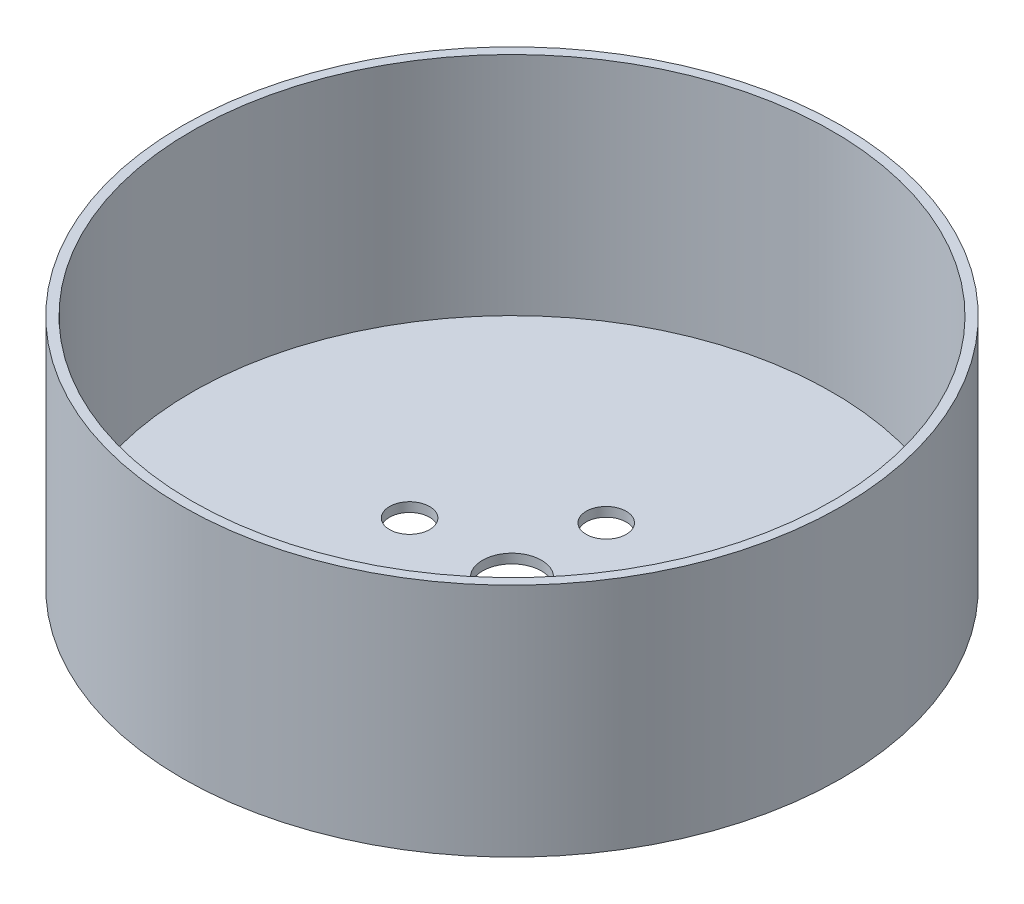
ISO-10303-21;
HEADER;
FILE_DESCRIPTION(('STEP AP214'),'2;1');
FILE_NAME('part.step','',(''),(''),'','','');
FILE_SCHEMA(('AUTOMOTIVE_DESIGN { 1 0 10303 214 1 1 1 1 }'));
ENDSEC;
DATA;
#1=APPLICATION_CONTEXT('core data for automotive mechanical design processes');
#2=APPLICATION_PROTOCOL_DEFINITION('international standard','automotive_design',2000,#1);
#3=PRODUCT_CONTEXT('',#1,'mechanical');
#4=PRODUCT('Part','Part','',(#3));
#5=PRODUCT_RELATED_PRODUCT_CATEGORY('part','',(#4));
#6=PRODUCT_DEFINITION_FORMATION('','',#4);
#7=PRODUCT_DEFINITION_CONTEXT('part definition',#1,'design');
#8=PRODUCT_DEFINITION('design','',#6,#7);
#9=PRODUCT_DEFINITION_SHAPE('','',#8);
#10=(LENGTH_UNIT() NAMED_UNIT(*) SI_UNIT(.MILLI.,.METRE.));
#11=(NAMED_UNIT(*) PLANE_ANGLE_UNIT() SI_UNIT($,.RADIAN.));
#12=(NAMED_UNIT(*) SI_UNIT($,.STERADIAN.) SOLID_ANGLE_UNIT());
#13=UNCERTAINTY_MEASURE_WITH_UNIT(LENGTH_MEASURE(1.E-05),#10,'distance_accuracy_value','');
#14=(GEOMETRIC_REPRESENTATION_CONTEXT(3) GLOBAL_UNCERTAINTY_ASSIGNED_CONTEXT((#13)) GLOBAL_UNIT_ASSIGNED_CONTEXT((#10,
#11,#12)) REPRESENTATION_CONTEXT('',''));
#15=CARTESIAN_POINT('',(0.,0.,0.));
#16=DIRECTION('',(0.,0.,1.));
#17=DIRECTION('',(1.,0.,0.));
#18=AXIS2_PLACEMENT_3D('',#15,#16,#17);
#19=CARTESIAN_POINT('',(0.,20.,0.));
#20=DIRECTION('',(0.,-1.,0.));
#21=DIRECTION('',(0.,0.,-1.));
#22=AXIS2_PLACEMENT_3D('',#19,#20,#21);
#23=CYLINDRICAL_SURFACE('',#22,28.);
#24=CARTESIAN_POINT('',(0.,20.,0.));
#25=DIRECTION('',(0.,1.,0.));
#26=DIRECTION('',(0.,0.,1.));
#27=AXIS2_PLACEMENT_3D('',#24,#25,#26);
#28=CIRCLE('',#27,28.);
#29=CARTESIAN_POINT('',(0.,20.,28.));
#30=VERTEX_POINT('',#29);
#31=EDGE_CURVE('E11',#30,#30,#28,.T.);
#32=ORIENTED_EDGE('',*,*,#31,.F.);
#33=EDGE_LOOP('',(#32));
#34=FACE_BOUND('',#33,.T.);
#35=CARTESIAN_POINT('',(0.,0.,0.));
#36=DIRECTION('',(0.,1.,0.));
#37=DIRECTION('',(0.,0.,1.));
#38=AXIS2_PLACEMENT_3D('',#35,#36,#37);
#39=CIRCLE('',#38,28.);
#40=CARTESIAN_POINT('',(0.,0.,28.));
#41=VERTEX_POINT('',#40);
#42=EDGE_CURVE('E40',#41,#41,#39,.T.);
#43=ORIENTED_EDGE('',*,*,#42,.T.);
#44=EDGE_LOOP('',(#43));
#45=FACE_BOUND('',#44,.T.);
#46=ADVANCED_FACE('F33',(#34,#45),#23,.T.);
#47=CARTESIAN_POINT('',(0.,20.,0.));
#48=DIRECTION('',(0.,1.,0.));
#49=DIRECTION('',(0.,0.,1.));
#50=AXIS2_PLACEMENT_3D('',#47,#48,#49);
#51=PLANE('',#50);
#52=CARTESIAN_POINT('',(0.,20.,0.));
#53=DIRECTION('',(0.,1.,0.));
#54=DIRECTION('',(0.,0.,1.));
#55=AXIS2_PLACEMENT_3D('',#52,#53,#54);
#56=CIRCLE('',#55,27.20625);
#57=CARTESIAN_POINT('',(0.,20.,27.20625));
#58=VERTEX_POINT('',#57);
#59=EDGE_CURVE('E53',#58,#58,#56,.T.);
#60=ORIENTED_EDGE('',*,*,#59,.F.);
#61=EDGE_LOOP('',(#60));
#62=FACE_BOUND('',#61,.T.);
#63=ORIENTED_EDGE('',*,*,#31,.T.);
#64=EDGE_LOOP('',(#63));
#65=FACE_BOUND('',#64,.T.);
#66=ADVANCED_FACE('F105',(#62,#65),#51,.T.);
#67=CARTESIAN_POINT('',(0.,0.,0.));
#68=DIRECTION('',(0.,1.,0.));
#69=DIRECTION('',(0.,0.,1.));
#70=AXIS2_PLACEMENT_3D('',#67,#68,#69);
#71=PLANE('',#70);
#72=CARTESIAN_POINT('',(0.,0.,0.));
#73=DIRECTION('',(0.,-1.,0.));
#74=DIRECTION('',(0.,0.,-1.));
#75=AXIS2_PLACEMENT_3D('',#72,#73,#74);
#76=CIRCLE('',#75,2.5);
#77=CARTESIAN_POINT('',(0.,0.,-2.5));
#78=VERTEX_POINT('',#77);
#79=EDGE_CURVE('E74',#78,#78,#76,.T.);
#80=ORIENTED_EDGE('',*,*,#79,.F.);
#81=EDGE_LOOP('',(#80));
#82=FACE_BOUND('',#81,.T.);
#83=CARTESIAN_POINT('',(0.,0.,-8.));
#84=DIRECTION('',(0.,-1.,0.));
#85=DIRECTION('',(0.,0.,-1.));
#86=AXIS2_PLACEMENT_3D('',#83,#84,#85);
#87=CIRCLE('',#86,1.69999999999999);
#88=CARTESIAN_POINT('',(0.,0.,-9.69999999999999));
#89=VERTEX_POINT('',#88);
#90=EDGE_CURVE('E64',#89,#89,#87,.T.);
#91=ORIENTED_EDGE('',*,*,#90,.F.);
#92=EDGE_LOOP('',(#91));
#93=FACE_BOUND('',#92,.T.);
#94=CARTESIAN_POINT('',(0.,0.,8.));
#95=DIRECTION('',(0.,-1.,0.));
#96=DIRECTION('',(0.,0.,-1.));
#97=AXIS2_PLACEMENT_3D('',#94,#95,#96);
#98=CIRCLE('',#97,1.69999999999999);
#99=CARTESIAN_POINT('',(0.,0.,6.30000000000001));
#100=VERTEX_POINT('',#99);
#101=EDGE_CURVE('E61',#100,#100,#98,.T.);
#102=ORIENTED_EDGE('',*,*,#101,.F.);
#103=EDGE_LOOP('',(#102));
#104=FACE_BOUND('',#103,.T.);
#105=CARTESIAN_POINT('',(8.700000126,0.,0.));
#106=DIRECTION('',(0.,-1.,0.));
#107=DIRECTION('',(0.,0.,-1.));
#108=AXIS2_PLACEMENT_3D('',#105,#106,#107);
#109=CIRCLE('',#108,1.69999999999999);
#110=CARTESIAN_POINT('',(8.700000126,0.,-1.69999999999999));
#111=VERTEX_POINT('',#110);
#112=EDGE_CURVE('E58',#111,#111,#109,.T.);
#113=ORIENTED_EDGE('',*,*,#112,.F.);
#114=EDGE_LOOP('',(#113));
#115=FACE_BOUND('',#114,.T.);
#116=CARTESIAN_POINT('',(-8.700000126,0.,0.));
#117=DIRECTION('',(0.,-1.,0.));
#118=DIRECTION('',(0.,0.,-1.));
#119=AXIS2_PLACEMENT_3D('',#116,#117,#118);
#120=CIRCLE('',#119,1.69999999999999);
#121=CARTESIAN_POINT('',(-8.700000126,0.,-1.69999999999999));
#122=VERTEX_POINT('',#121);
#123=EDGE_CURVE('E54',#122,#122,#120,.T.);
#124=ORIENTED_EDGE('',*,*,#123,.F.);
#125=EDGE_LOOP('',(#124));
#126=FACE_BOUND('',#125,.T.);
#127=ORIENTED_EDGE('',*,*,#42,.F.);
#128=EDGE_LOOP('',(#127));
#129=FACE_BOUND('',#128,.T.);
#130=ADVANCED_FACE('F100',(#82,#93,#104,#115,#126,#129),#71,.F.);
#131=CARTESIAN_POINT('',(0.,-76.950895462626,0.));
#132=DIRECTION('',(0.,1.,0.));
#133=DIRECTION('',(0.,0.,1.));
#134=AXIS2_PLACEMENT_3D('',#131,#132,#133);
#135=CYLINDRICAL_SURFACE('',#134,27.20625);
#136=CARTESIAN_POINT('',(0.,0.793749999999996,0.));
#137=DIRECTION('',(0.,1.,0.));
#138=DIRECTION('',(0.,0.,1.));
#139=AXIS2_PLACEMENT_3D('',#136,#137,#138);
#140=CIRCLE('',#139,27.20625);
#141=CARTESIAN_POINT('',(0.,0.793749999999996,27.20625));
#142=VERTEX_POINT('',#141);
#143=EDGE_CURVE('E45',#142,#142,#140,.F.);
#144=CARTESIAN_POINT('',(0.,0.793749999999996,27.20625));
#145=CARTESIAN_POINT('',(0.,0.993815104166661,27.20625));
#146=CARTESIAN_POINT('',(0.,1.19388020833333,27.20625));
#147=CARTESIAN_POINT('',(0.,1.59401041666666,27.20625));
#148=CARTESIAN_POINT('',(0.,1.79407552083333,27.20625));
#149=CARTESIAN_POINT('',(0.,2.19420572916667,27.20625));
#150=CARTESIAN_POINT('',(0.,2.39427083333333,27.20625));
#151=CARTESIAN_POINT('',(0.,2.79440104166666,27.20625));
#152=CARTESIAN_POINT('',(0.,2.99446614583333,27.20625));
#153=CARTESIAN_POINT('',(0.,3.39459635416666,27.20625));
#154=CARTESIAN_POINT('',(0.,3.59466145833333,27.20625));
#155=CARTESIAN_POINT('',(0.,3.99479166666667,27.20625));
#156=CARTESIAN_POINT('',(0.,4.19485677083333,27.20625));
#157=CARTESIAN_POINT('',(0.,4.59498697916666,27.20625));
#158=CARTESIAN_POINT('',(0.,4.79505208333333,27.20625));
#159=CARTESIAN_POINT('',(0.,5.19518229166666,27.20625));
#160=CARTESIAN_POINT('',(0.,5.39524739583333,27.20625));
#161=CARTESIAN_POINT('',(0.,5.79537760416666,27.20625));
#162=CARTESIAN_POINT('',(0.,5.99544270833333,27.20625));
#163=CARTESIAN_POINT('',(0.,6.39557291666667,27.20625));
#164=CARTESIAN_POINT('',(0.,6.59563802083333,27.20625));
#165=CARTESIAN_POINT('',(0.,6.99576822916666,27.20625));
#166=CARTESIAN_POINT('',(0.,7.19583333333333,27.20625));
#167=CARTESIAN_POINT('',(0.,7.59596354166666,27.20625));
#168=CARTESIAN_POINT('',(0.,7.79602864583333,27.20625));
#169=CARTESIAN_POINT('',(0.,8.19615885416667,27.20625));
#170=CARTESIAN_POINT('',(0.,8.39622395833333,27.20625));
#171=CARTESIAN_POINT('',(0.,8.79635416666666,27.20625));
#172=CARTESIAN_POINT('',(0.,8.99641927083333,27.20625));
#173=CARTESIAN_POINT('',(0.,9.39654947916666,27.20625));
#174=CARTESIAN_POINT('',(0.,9.59661458333333,27.20625));
#175=CARTESIAN_POINT('',(0.,9.99674479166667,27.20625));
#176=CARTESIAN_POINT('',(0.,10.1968098958333,27.20625));
#177=CARTESIAN_POINT('',(0.,10.5969401041667,27.20625));
#178=CARTESIAN_POINT('',(0.,10.7970052083333,27.20625));
#179=CARTESIAN_POINT('',(0.,11.1971354166667,27.20625));
#180=CARTESIAN_POINT('',(0.,11.3972005208333,27.20625));
#181=CARTESIAN_POINT('',(0.,11.7973307291667,27.20625));
#182=CARTESIAN_POINT('',(0.,11.9973958333333,27.20625));
#183=CARTESIAN_POINT('',(0.,12.3975260416667,27.20625));
#184=CARTESIAN_POINT('',(0.,12.5975911458333,27.20625));
#185=CARTESIAN_POINT('',(0.,12.9977213541667,27.20625));
#186=CARTESIAN_POINT('',(0.,13.1977864583333,27.20625));
#187=CARTESIAN_POINT('',(0.,13.5979166666667,27.20625));
#188=CARTESIAN_POINT('',(0.,13.7979817708333,27.20625));
#189=CARTESIAN_POINT('',(0.,14.1981119791667,27.20625));
#190=CARTESIAN_POINT('',(0.,14.3981770833333,27.20625));
#191=CARTESIAN_POINT('',(0.,14.7983072916667,27.20625));
#192=CARTESIAN_POINT('',(0.,14.9983723958333,27.20625));
#193=CARTESIAN_POINT('',(0.,15.3985026041667,27.20625));
#194=CARTESIAN_POINT('',(0.,15.5985677083333,27.20625));
#195=CARTESIAN_POINT('',(0.,15.9986979166667,27.20625));
#196=CARTESIAN_POINT('',(0.,16.1987630208333,27.20625));
#197=CARTESIAN_POINT('',(0.,16.5988932291667,27.20625));
#198=CARTESIAN_POINT('',(0.,16.7989583333333,27.20625));
#199=CARTESIAN_POINT('',(0.,17.1990885416667,27.20625));
#200=CARTESIAN_POINT('',(0.,17.3991536458333,27.20625));
#201=CARTESIAN_POINT('',(0.,17.7992838541667,27.20625));
#202=CARTESIAN_POINT('',(0.,17.9993489583333,27.20625));
#203=CARTESIAN_POINT('',(0.,18.3994791666667,27.20625));
#204=CARTESIAN_POINT('',(0.,18.5995442708333,27.20625));
#205=CARTESIAN_POINT('',(0.,18.9996744791667,27.20625));
#206=CARTESIAN_POINT('',(0.,19.1997395833333,27.20625));
#207=CARTESIAN_POINT('',(0.,19.5998697916667,27.20625));
#208=CARTESIAN_POINT('',(0.,19.7999348958333,27.20625));
#209=CARTESIAN_POINT('',(0.,20.,27.20625));
#210=B_SPLINE_CURVE_WITH_KNOTS('',3,(#144,#145,#146,#147,#148,#149,#150,#151,#152,#153,#154,
#155,#156,#157,#158,#159,#160,#161,#162,#163,#164,#165,#166,#167,#168,#169,#170,#171,#172,#173,
#174,#175,#176,#177,#178,#179,#180,#181,#182,#183,#184,#185,#186,#187,#188,#189,#190,#191,#192,
#193,#194,#195,#196,#197,#198,#199,#200,#201,#202,#203,#204,#205,#206,#207,#208,#209),
.UNSPECIFIED.,.F.,.F.,(4,2,2,2,2,2,2,2,2,2,2,2,2,2,2,2,2,2,2,2,2,2,2,2,2,2,2,2,2,2,2,2,4),(0.,
0.600195312499996,1.20039062500001,1.8005859375,2.40078125,3.00097656250001,3.601171875,
4.2013671875,4.80156249999999,5.4017578125,6.001953125,6.6021484375,7.20234375000001,
7.8025390625,8.402734375,9.00292968750001,9.603125,10.2033203125,10.803515625,11.4037109375,
12.00390625,12.6041015625,13.204296875,13.8044921875,14.4046875,15.0048828125,15.605078125,
16.2052734375,16.80546875,17.4056640625,18.005859375,18.6060546875,19.20625),.UNSPECIFIED.);
#211=EDGE_CURVE('BSEAM86',#142,#58,#210,.T.);
#212=ORIENTED_EDGE('',*,*,#143,.T.);
#213=ORIENTED_EDGE('',*,*,#59,.T.);
#214=ORIENTED_EDGE('',*,*,#211,.T.);
#215=ORIENTED_EDGE('',*,*,#211,.F.);
#216=EDGE_LOOP('',(#212,#214,#213,#215));
#217=FACE_BOUND('',#216,.T.);
#218=ADVANCED_FACE('F86',(#217),#135,.F.);
#219=CARTESIAN_POINT('',(0.,0.79375,0.));
#220=DIRECTION('',(0.,1.,0.));
#221=DIRECTION('',(0.,0.,1.));
#222=AXIS2_PLACEMENT_3D('',#219,#220,#221);
#223=PLANE('',#222);
#224=CARTESIAN_POINT('',(0.,0.793749999999999,0.));
#225=DIRECTION('',(0.,1.,0.));
#226=DIRECTION('',(0.,0.,1.));
#227=AXIS2_PLACEMENT_3D('',#224,#225,#226);
#228=CIRCLE('',#227,2.5);
#229=CARTESIAN_POINT('',(0.,0.793749999999999,2.5));
#230=VERTEX_POINT('',#229);
#231=EDGE_CURVE('E36',#230,#230,#228,.T.);
#232=ORIENTED_EDGE('',*,*,#231,.F.);
#233=EDGE_LOOP('',(#232));
#234=FACE_BOUND('',#233,.T.);
#235=CARTESIAN_POINT('',(0.,0.79375,-8.));
#236=DIRECTION('',(0.,1.,0.));
#237=DIRECTION('',(0.,0.,1.));
#238=AXIS2_PLACEMENT_3D('',#235,#236,#237);
#239=CIRCLE('',#238,1.69999999999999);
#240=CARTESIAN_POINT('',(0.,0.79375,-6.30000000000001));
#241=VERTEX_POINT('',#240);
#242=EDGE_CURVE('E62',#241,#241,#239,.T.);
#243=ORIENTED_EDGE('',*,*,#242,.F.);
#244=EDGE_LOOP('',(#243));
#245=FACE_BOUND('',#244,.T.);
#246=CARTESIAN_POINT('',(0.,0.79375,8.));
#247=DIRECTION('',(0.,1.,0.));
#248=DIRECTION('',(0.,0.,1.));
#249=AXIS2_PLACEMENT_3D('',#246,#247,#248);
#250=CIRCLE('',#249,1.69999999999999);
#251=CARTESIAN_POINT('',(0.,0.79375,9.69999999999999));
#252=VERTEX_POINT('',#251);
#253=EDGE_CURVE('E59',#252,#252,#250,.T.);
#254=ORIENTED_EDGE('',*,*,#253,.F.);
#255=EDGE_LOOP('',(#254));
#256=FACE_BOUND('',#255,.T.);
#257=CARTESIAN_POINT('',(8.700000126,0.79375,0.));
#258=DIRECTION('',(0.,1.,0.));
#259=DIRECTION('',(0.,0.,1.));
#260=AXIS2_PLACEMENT_3D('',#257,#258,#259);
#261=CIRCLE('',#260,1.69999999999999);
#262=CARTESIAN_POINT('',(8.700000126,0.79375,1.69999999999999));
#263=VERTEX_POINT('',#262);
#264=EDGE_CURVE('E55',#263,#263,#261,.T.);
#265=ORIENTED_EDGE('',*,*,#264,.F.);
#266=EDGE_LOOP('',(#265));
#267=FACE_BOUND('',#266,.T.);
#268=CARTESIAN_POINT('',(-8.700000126,0.79375,0.));
#269=DIRECTION('',(0.,1.,0.));
#270=DIRECTION('',(0.,0.,1.));
#271=AXIS2_PLACEMENT_3D('',#268,#269,#270);
#272=CIRCLE('',#271,1.69999999999999);
#273=CARTESIAN_POINT('',(-8.700000126,0.79375,1.69999999999999));
#274=VERTEX_POINT('',#273);
#275=EDGE_CURVE('E50',#274,#274,#272,.T.);
#276=ORIENTED_EDGE('',*,*,#275,.F.);
#277=EDGE_LOOP('',(#276));
#278=FACE_BOUND('',#277,.T.);
#279=ORIENTED_EDGE('',*,*,#143,.F.);
#280=EDGE_LOOP('',(#279));
#281=FACE_BOUND('',#280,.T.);
#282=ADVANCED_FACE('F88',(#234,#245,#256,#267,#278,#281),#223,.T.);
#283=CARTESIAN_POINT('',(-8.700000126,0.,0.));
#284=DIRECTION('',(0.,-1.,0.));
#285=DIRECTION('',(0.,0.,-1.));
#286=AXIS2_PLACEMENT_3D('',#283,#284,#285);
#287=CYLINDRICAL_SURFACE('',#286,1.69999999999999);
#288=ORIENTED_EDGE('',*,*,#275,.T.);
#289=EDGE_LOOP('',(#288));
#290=FACE_BOUND('',#289,.T.);
#291=ORIENTED_EDGE('',*,*,#123,.T.);
#292=EDGE_LOOP('',(#291));
#293=FACE_BOUND('',#292,.T.);
#294=ADVANCED_FACE('F90',(#290,#293),#287,.F.);
#295=CARTESIAN_POINT('',(8.700000126,0.,0.));
#296=DIRECTION('',(0.,-1.,0.));
#297=DIRECTION('',(0.,0.,-1.));
#298=AXIS2_PLACEMENT_3D('',#295,#296,#297);
#299=CYLINDRICAL_SURFACE('',#298,1.69999999999999);
#300=ORIENTED_EDGE('',*,*,#264,.T.);
#301=EDGE_LOOP('',(#300));
#302=FACE_BOUND('',#301,.T.);
#303=ORIENTED_EDGE('',*,*,#112,.T.);
#304=EDGE_LOOP('',(#303));
#305=FACE_BOUND('',#304,.T.);
#306=ADVANCED_FACE('F97',(#302,#305),#299,.F.);
#307=CARTESIAN_POINT('',(0.,0.,8.));
#308=DIRECTION('',(0.,-1.,0.));
#309=DIRECTION('',(0.,0.,-1.));
#310=AXIS2_PLACEMENT_3D('',#307,#308,#309);
#311=CYLINDRICAL_SURFACE('',#310,1.69999999999999);
#312=ORIENTED_EDGE('',*,*,#253,.T.);
#313=EDGE_LOOP('',(#312));
#314=FACE_BOUND('',#313,.T.);
#315=ORIENTED_EDGE('',*,*,#101,.T.);
#316=EDGE_LOOP('',(#315));
#317=FACE_BOUND('',#316,.T.);
#318=ADVANCED_FACE('F131',(#314,#317),#311,.F.);
#319=CARTESIAN_POINT('',(0.,0.,-8.));
#320=DIRECTION('',(0.,-1.,0.));
#321=DIRECTION('',(0.,0.,-1.));
#322=AXIS2_PLACEMENT_3D('',#319,#320,#321);
#323=CYLINDRICAL_SURFACE('',#322,1.69999999999999);
#324=ORIENTED_EDGE('',*,*,#242,.T.);
#325=EDGE_LOOP('',(#324));
#326=FACE_BOUND('',#325,.T.);
#327=ORIENTED_EDGE('',*,*,#90,.T.);
#328=EDGE_LOOP('',(#327));
#329=FACE_BOUND('',#328,.T.);
#330=ADVANCED_FACE('F137',(#326,#329),#323,.F.);
#331=CARTESIAN_POINT('',(0.,20.,0.));
#332=DIRECTION('',(0.,-1.,0.));
#333=DIRECTION('',(0.,0.,-1.));
#334=AXIS2_PLACEMENT_3D('',#331,#332,#333);
#335=CYLINDRICAL_SURFACE('',#334,2.5);
#336=ORIENTED_EDGE('',*,*,#231,.T.);
#337=EDGE_LOOP('',(#336));
#338=FACE_BOUND('',#337,.T.);
#339=ORIENTED_EDGE('',*,*,#79,.T.);
#340=EDGE_LOOP('',(#339));
#341=FACE_BOUND('',#340,.T.);
#342=ADVANCED_FACE('F143',(#338,#341),#335,.F.);
#343=CLOSED_SHELL('',(#46,#66,#130,#218,#282,#294,#306,#318,#330,#342));
#344=MANIFOLD_SOLID_BREP('B2',#343);
#345=ADVANCED_BREP_SHAPE_REPRESENTATION('',(#18,#344),#14);
#346=SHAPE_DEFINITION_REPRESENTATION(#9,#345);
ENDSEC;
END-ISO-10303-21;
